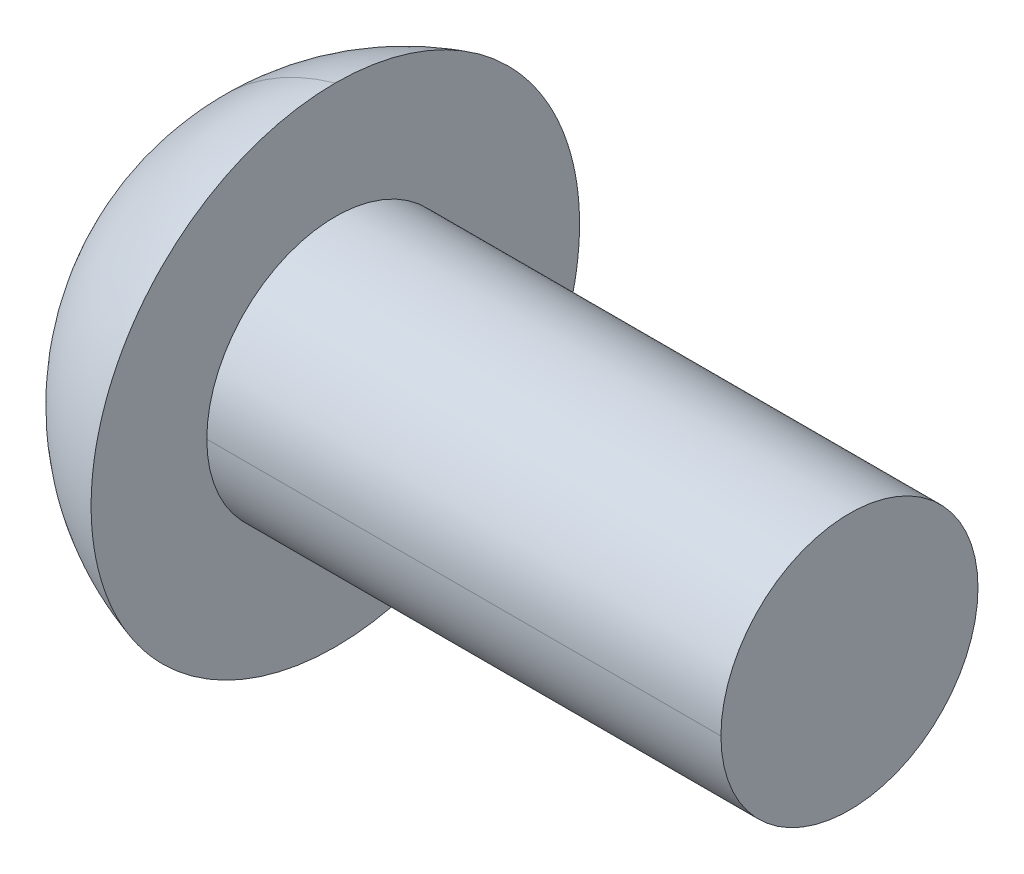
ISO-10303-21;
HEADER;
FILE_DESCRIPTION(('STEP AP214'),'2;1');
FILE_NAME('part.step','',(''),(''),'','','');
FILE_SCHEMA(('AUTOMOTIVE_DESIGN { 1 0 10303 214 1 1 1 1 }'));
ENDSEC;
DATA;
#1=APPLICATION_CONTEXT('core data for automotive mechanical design processes');
#2=APPLICATION_PROTOCOL_DEFINITION('international standard','automotive_design',2000,#1);
#3=PRODUCT_CONTEXT('',#1,'mechanical');
#4=PRODUCT('Part','Part','',(#3));
#5=PRODUCT_RELATED_PRODUCT_CATEGORY('part','',(#4));
#6=PRODUCT_DEFINITION_FORMATION('','',#4);
#7=PRODUCT_DEFINITION_CONTEXT('part definition',#1,'design');
#8=PRODUCT_DEFINITION('design','',#6,#7);
#9=PRODUCT_DEFINITION_SHAPE('','',#8);
#10=(LENGTH_UNIT() NAMED_UNIT(*) SI_UNIT(.MILLI.,.METRE.));
#11=(NAMED_UNIT(*) PLANE_ANGLE_UNIT() SI_UNIT($,.RADIAN.));
#12=(NAMED_UNIT(*) SI_UNIT($,.STERADIAN.) SOLID_ANGLE_UNIT());
#13=UNCERTAINTY_MEASURE_WITH_UNIT(LENGTH_MEASURE(1.E-05),#10,'distance_accuracy_value','');
#14=(GEOMETRIC_REPRESENTATION_CONTEXT(3) GLOBAL_UNCERTAINTY_ASSIGNED_CONTEXT((#13)) GLOBAL_UNIT_ASSIGNED_CONTEXT((#10,
#11,#12)) REPRESENTATION_CONTEXT('',''));
#15=CARTESIAN_POINT('',(0.,0.,0.));
#16=DIRECTION('',(0.,0.,1.));
#17=DIRECTION('',(1.,0.,0.));
#18=AXIS2_PLACEMENT_3D('',#15,#16,#17);
#19=CARTESIAN_POINT('',(1.04,1.,0.577350269189625));
#20=DIRECTION('',(0.86602540378444,0.25,0.433012701892218));
#21=DIRECTION('',(0.,-0.866025403784439,0.5));
#22=AXIS2_PLACEMENT_3D('',#19,#20,#21);
#23=PLANE('',#22);
#24=DIRECTION('',(0.,-0.866025403784439,0.5));
#25=VECTOR('',#24,1.);
#26=CARTESIAN_POINT('',(1.04,1.,0.577350269189625));
#27=LINE('',#26,#25);
#28=CARTESIAN_POINT('',(1.04,1.,0.577350269189625));
#29=VERTEX_POINT('',#28);
#30=CARTESIAN_POINT('',(1.04,0.,1.15470053837925));
#31=VERTEX_POINT('',#30);
#32=EDGE_CURVE('E208',#29,#31,#27,.T.);
#33=ORIENTED_EDGE('',*,*,#32,.F.);
#34=DIRECTION('',(-0.447213595499956,0.774596669241484,0.447213595499959));
#35=VECTOR('',#34,1.);
#36=CARTESIAN_POINT('',(1.04,1.,0.577350269189625));
#37=LINE('',#36,#35);
#38=CARTESIAN_POINT('',(1.61735026918963,0.,0.));
#39=VERTEX_POINT('',#38);
#40=EDGE_CURVE('E11',#39,#29,#37,.T.);
#41=ORIENTED_EDGE('',*,*,#40,.F.);
#42=DIRECTION('',(-0.447213595499956,0.,0.894427190999917));
#43=VECTOR('',#42,1.);
#44=CARTESIAN_POINT('',(1.04,0.,1.15470053837925));
#45=LINE('',#44,#43);
#46=EDGE_CURVE('E230',#39,#31,#45,.T.);
#47=ORIENTED_EDGE('',*,*,#46,.T.);
#48=EDGE_LOOP('',(#33,#41,#47));
#49=FACE_BOUND('',#48,.T.);
#50=ADVANCED_FACE('F17',(#49),#23,.F.);
#51=CARTESIAN_POINT('',(1.04,1.,-0.577350269189626));
#52=DIRECTION('',(0.86602540378444,0.5,0.));
#53=DIRECTION('',(0.,0.,-1.));
#54=AXIS2_PLACEMENT_3D('',#51,#52,#53);
#55=PLANE('',#54);
#56=DIRECTION('',(0.,0.,1.));
#57=VECTOR('',#56,1.);
#58=CARTESIAN_POINT('',(1.04,1.,-0.577350269189626));
#59=LINE('',#58,#57);
#60=CARTESIAN_POINT('',(1.04,1.,-0.577350269189626));
#61=VERTEX_POINT('',#60);
#62=EDGE_CURVE('E201',#61,#29,#59,.T.);
#63=ORIENTED_EDGE('',*,*,#62,.F.);
#64=DIRECTION('',(-0.447213595499956,0.774596669241484,-0.447213595499959));
#65=VECTOR('',#64,1.);
#66=CARTESIAN_POINT('',(1.04,1.,-0.577350269189626));
#67=LINE('',#66,#65);
#68=EDGE_CURVE('E25',#39,#61,#67,.T.);
#69=ORIENTED_EDGE('',*,*,#68,.F.);
#70=ORIENTED_EDGE('',*,*,#40,.T.);
#71=EDGE_LOOP('',(#63,#69,#70));
#72=FACE_BOUND('',#71,.T.);
#73=ADVANCED_FACE('F248',(#72),#55,.F.);
#74=CARTESIAN_POINT('',(1.04,0.,-1.15470053837925));
#75=DIRECTION('',(0.86602540378444,0.25,-0.433012701892218));
#76=DIRECTION('',(0.,-0.866025403784439,-0.5));
#77=AXIS2_PLACEMENT_3D('',#74,#75,#76);
#78=PLANE('',#77);
#79=DIRECTION('',(0.,0.866025403784439,0.5));
#80=VECTOR('',#79,1.);
#81=CARTESIAN_POINT('',(1.04,0.,-1.15470053837925));
#82=LINE('',#81,#80);
#83=CARTESIAN_POINT('',(1.04,0.,-1.15470053837925));
#84=VERTEX_POINT('',#83);
#85=EDGE_CURVE('E173',#84,#61,#82,.T.);
#86=ORIENTED_EDGE('',*,*,#85,.F.);
#87=DIRECTION('',(-0.447213595499956,0.,-0.894427190999917));
#88=VECTOR('',#87,1.);
#89=CARTESIAN_POINT('',(1.04,0.,-1.15470053837925));
#90=LINE('',#89,#88);
#91=EDGE_CURVE('E209',#39,#84,#90,.T.);
#92=ORIENTED_EDGE('',*,*,#91,.F.);
#93=ORIENTED_EDGE('',*,*,#68,.T.);
#94=EDGE_LOOP('',(#86,#92,#93));
#95=FACE_BOUND('',#94,.T.);
#96=ADVANCED_FACE('F243',(#95),#78,.F.);
#97=CARTESIAN_POINT('',(1.04,-1.,-0.577350269189628));
#98=DIRECTION('',(0.86602540378444,-0.25,-0.433012701892218));
#99=DIRECTION('',(0.,-0.866025403784439,0.5));
#100=AXIS2_PLACEMENT_3D('',#97,#98,#99);
#101=PLANE('',#100);
#102=DIRECTION('',(0.,0.866025403784439,-0.5));
#103=VECTOR('',#102,1.);
#104=CARTESIAN_POINT('',(1.04,-1.,-0.577350269189628));
#105=LINE('',#104,#103);
#106=CARTESIAN_POINT('',(1.04,-1.,-0.577350269189628));
#107=VERTEX_POINT('',#106);
#108=EDGE_CURVE('E174',#107,#84,#105,.T.);
#109=ORIENTED_EDGE('',*,*,#108,.F.);
#110=DIRECTION('',(-0.447213595499956,-0.774596669241484,-0.447213595499959));
#111=VECTOR('',#110,1.);
#112=CARTESIAN_POINT('',(1.04,-1.,-0.577350269189628));
#113=LINE('',#112,#111);
#114=EDGE_CURVE('E212',#39,#107,#113,.T.);
#115=ORIENTED_EDGE('',*,*,#114,.F.);
#116=ORIENTED_EDGE('',*,*,#91,.T.);
#117=EDGE_LOOP('',(#109,#115,#116));
#118=FACE_BOUND('',#117,.T.);
#119=ADVANCED_FACE('F261',(#118),#101,.F.);
#120=CARTESIAN_POINT('',(1.04,-1.,0.577350269189625));
#121=DIRECTION('',(0.86602540378444,-0.5,0.));
#122=DIRECTION('',(0.,0.,-1.));
#123=AXIS2_PLACEMENT_3D('',#120,#121,#122);
#124=PLANE('',#123);
#125=DIRECTION('',(0.,0.,-1.));
#126=VECTOR('',#125,1.);
#127=CARTESIAN_POINT('',(1.04,-1.,0.577350269189625));
#128=LINE('',#127,#126);
#129=CARTESIAN_POINT('',(1.04,-1.,0.577350269189625));
#130=VERTEX_POINT('',#129);
#131=EDGE_CURVE('E226',#130,#107,#128,.T.);
#132=ORIENTED_EDGE('',*,*,#131,.F.);
#133=DIRECTION('',(-0.447213595499956,-0.774596669241484,0.447213595499959));
#134=VECTOR('',#133,1.);
#135=CARTESIAN_POINT('',(1.04,-1.,0.577350269189625));
#136=LINE('',#135,#134);
#137=EDGE_CURVE('E47',#39,#130,#136,.T.);
#138=ORIENTED_EDGE('',*,*,#137,.F.);
#139=ORIENTED_EDGE('',*,*,#114,.T.);
#140=EDGE_LOOP('',(#132,#138,#139));
#141=FACE_BOUND('',#140,.T.);
#142=ADVANCED_FACE('F263',(#141),#124,.F.);
#143=CARTESIAN_POINT('',(1.04,0.,1.15470053837925));
#144=DIRECTION('',(0.86602540378444,-0.25,0.433012701892218));
#145=DIRECTION('',(0.,-0.866025403784439,-0.5));
#146=AXIS2_PLACEMENT_3D('',#143,#144,#145);
#147=PLANE('',#146);
#148=DIRECTION('',(0.,-0.866025403784439,-0.5));
#149=VECTOR('',#148,1.);
#150=CARTESIAN_POINT('',(1.04,0.,1.15470053837925));
#151=LINE('',#150,#149);
#152=EDGE_CURVE('E219',#31,#130,#151,.T.);
#153=ORIENTED_EDGE('',*,*,#152,.F.);
#154=ORIENTED_EDGE('',*,*,#46,.F.);
#155=ORIENTED_EDGE('',*,*,#137,.T.);
#156=EDGE_LOOP('',(#153,#154,#155));
#157=FACE_BOUND('',#156,.T.);
#158=ADVANCED_FACE('F265',(#157),#147,.F.);
#159=CARTESIAN_POINT('',(1.04,-1.,0.577350269189625));
#160=DIRECTION('',(0.,1.,0.));
#161=DIRECTION('',(1.,0.,0.));
#162=AXIS2_PLACEMENT_3D('',#159,#160,#161);
#163=PLANE('',#162);
#164=DIRECTION('',(0.,0.,-1.));
#165=VECTOR('',#164,1.);
#166=CARTESIAN_POINT('',(0.,-1.,0.577350269189625));
#167=LINE('',#166,#165);
#168=CARTESIAN_POINT('',(0.,-1.,0.577350269189625));
#169=VERTEX_POINT('',#168);
#170=CARTESIAN_POINT('',(0.,-1.,-0.577350269189628));
#171=VERTEX_POINT('',#170);
#172=EDGE_CURVE('E185',#169,#171,#167,.T.);
#173=ORIENTED_EDGE('',*,*,#172,.F.);
#174=DIRECTION('',(-1.,0.,0.));
#175=VECTOR('',#174,1.);
#176=CARTESIAN_POINT('',(1.04,-1.,0.577350269189625));
#177=LINE('',#176,#175);
#178=EDGE_CURVE('E223',#130,#169,#177,.T.);
#179=ORIENTED_EDGE('',*,*,#178,.F.);
#180=ORIENTED_EDGE('',*,*,#131,.T.);
#181=DIRECTION('',(-1.,0.,0.));
#182=VECTOR('',#181,1.);
#183=CARTESIAN_POINT('',(1.04,-1.,-0.577350269189628));
#184=LINE('',#183,#182);
#185=EDGE_CURVE('E189',#107,#171,#184,.T.);
#186=ORIENTED_EDGE('',*,*,#185,.T.);
#187=EDGE_LOOP('',(#173,#179,#180,#186));
#188=FACE_BOUND('',#187,.T.);
#189=ADVANCED_FACE('F331',(#188),#163,.T.);
#190=CARTESIAN_POINT('',(1.04,0.,1.15470053837925));
#191=DIRECTION('',(0.,0.5,-0.866025403784439));
#192=DIRECTION('',(-1.,0.,0.));
#193=AXIS2_PLACEMENT_3D('',#190,#191,#192);
#194=PLANE('',#193);
#195=DIRECTION('',(0.,-0.866025403784439,-0.5));
#196=VECTOR('',#195,1.);
#197=CARTESIAN_POINT('',(0.,0.,1.15470053837925));
#198=LINE('',#197,#196);
#199=CARTESIAN_POINT('',(0.,0.,1.15470053837925));
#200=VERTEX_POINT('',#199);
#201=EDGE_CURVE('E182',#200,#169,#198,.T.);
#202=ORIENTED_EDGE('',*,*,#201,.F.);
#203=DIRECTION('',(-1.,0.,0.));
#204=VECTOR('',#203,1.);
#205=CARTESIAN_POINT('',(1.04,0.,1.15470053837925));
#206=LINE('',#205,#204);
#207=EDGE_CURVE('E216',#31,#200,#206,.T.);
#208=ORIENTED_EDGE('',*,*,#207,.F.);
#209=ORIENTED_EDGE('',*,*,#152,.T.);
#210=ORIENTED_EDGE('',*,*,#178,.T.);
#211=EDGE_LOOP('',(#202,#208,#209,#210));
#212=FACE_BOUND('',#211,.T.);
#213=ADVANCED_FACE('F329',(#212),#194,.T.);
#214=CARTESIAN_POINT('',(1.04,1.,0.577350269189625));
#215=DIRECTION('',(0.,-0.5,-0.866025403784439));
#216=DIRECTION('',(0.,-0.866025403784439,0.5));
#217=AXIS2_PLACEMENT_3D('',#214,#215,#216);
#218=PLANE('',#217);
#219=DIRECTION('',(0.,-0.866025403784439,0.5));
#220=VECTOR('',#219,1.);
#221=CARTESIAN_POINT('',(0.,1.,0.577350269189625));
#222=LINE('',#221,#220);
#223=CARTESIAN_POINT('',(0.,1.,0.577350269189625));
#224=VERTEX_POINT('',#223);
#225=EDGE_CURVE('E178',#224,#200,#222,.T.);
#226=ORIENTED_EDGE('',*,*,#225,.F.);
#227=DIRECTION('',(-1.,0.,0.));
#228=VECTOR('',#227,1.);
#229=CARTESIAN_POINT('',(1.04,1.,0.577350269189625));
#230=LINE('',#229,#228);
#231=EDGE_CURVE('E205',#29,#224,#230,.T.);
#232=ORIENTED_EDGE('',*,*,#231,.F.);
#233=ORIENTED_EDGE('',*,*,#32,.T.);
#234=ORIENTED_EDGE('',*,*,#207,.T.);
#235=EDGE_LOOP('',(#226,#232,#233,#234));
#236=FACE_BOUND('',#235,.T.);
#237=ADVANCED_FACE('F270',(#236),#218,.T.);
#238=CARTESIAN_POINT('',(1.04,1.,-0.577350269189626));
#239=DIRECTION('',(0.,-1.,0.));
#240=DIRECTION('',(-1.,0.,0.));
#241=AXIS2_PLACEMENT_3D('',#238,#239,#240);
#242=PLANE('',#241);
#243=DIRECTION('',(0.,0.,1.));
#244=VECTOR('',#243,1.);
#245=CARTESIAN_POINT('',(0.,1.,-0.577350269189626));
#246=LINE('',#245,#244);
#247=CARTESIAN_POINT('',(0.,1.,-0.577350269189626));
#248=VERTEX_POINT('',#247);
#249=EDGE_CURVE('E165',#248,#224,#246,.T.);
#250=ORIENTED_EDGE('',*,*,#249,.F.);
#251=DIRECTION('',(-1.,0.,0.));
#252=VECTOR('',#251,1.);
#253=CARTESIAN_POINT('',(1.04,1.,-0.577350269189626));
#254=LINE('',#253,#252);
#255=EDGE_CURVE('E198',#61,#248,#254,.T.);
#256=ORIENTED_EDGE('',*,*,#255,.F.);
#257=ORIENTED_EDGE('',*,*,#62,.T.);
#258=ORIENTED_EDGE('',*,*,#231,.T.);
#259=EDGE_LOOP('',(#250,#256,#257,#258));
#260=FACE_BOUND('',#259,.T.);
#261=ADVANCED_FACE('F251',(#260),#242,.T.);
#262=CARTESIAN_POINT('',(1.04,0.,-1.15470053837925));
#263=DIRECTION('',(0.,-0.5,0.866025403784439));
#264=DIRECTION('',(-1.,0.,0.));
#265=AXIS2_PLACEMENT_3D('',#262,#263,#264);
#266=PLANE('',#265);
#267=DIRECTION('',(0.,0.866025403784439,0.5));
#268=VECTOR('',#267,1.);
#269=CARTESIAN_POINT('',(0.,0.,-1.15470053837925));
#270=LINE('',#269,#268);
#271=CARTESIAN_POINT('',(0.,0.,-1.15470053837925));
#272=VERTEX_POINT('',#271);
#273=EDGE_CURVE('E161',#272,#248,#270,.T.);
#274=ORIENTED_EDGE('',*,*,#273,.F.);
#275=DIRECTION('',(-1.,0.,0.));
#276=VECTOR('',#275,1.);
#277=CARTESIAN_POINT('',(1.04,0.,-1.15470053837925));
#278=LINE('',#277,#276);
#279=EDGE_CURVE('E170',#84,#272,#278,.T.);
#280=ORIENTED_EDGE('',*,*,#279,.F.);
#281=ORIENTED_EDGE('',*,*,#85,.T.);
#282=ORIENTED_EDGE('',*,*,#255,.T.);
#283=EDGE_LOOP('',(#274,#280,#281,#282));
#284=FACE_BOUND('',#283,.T.);
#285=ADVANCED_FACE('F254',(#284),#266,.T.);
#286=CARTESIAN_POINT('',(1.04,-1.,-0.577350269189628));
#287=DIRECTION('',(0.,0.5,0.866025403784439));
#288=DIRECTION('',(1.,0.,0.));
#289=AXIS2_PLACEMENT_3D('',#286,#287,#288);
#290=PLANE('',#289);
#291=DIRECTION('',(0.,0.866025403784439,-0.5));
#292=VECTOR('',#291,1.);
#293=CARTESIAN_POINT('',(0.,-1.,-0.577350269189628));
#294=LINE('',#293,#292);
#295=EDGE_CURVE('E166',#171,#272,#294,.T.);
#296=ORIENTED_EDGE('',*,*,#295,.F.);
#297=ORIENTED_EDGE('',*,*,#185,.F.);
#298=ORIENTED_EDGE('',*,*,#108,.T.);
#299=ORIENTED_EDGE('',*,*,#279,.T.);
#300=EDGE_LOOP('',(#296,#297,#298,#299));
#301=FACE_BOUND('',#300,.T.);
#302=ADVANCED_FACE('F259',(#301),#290,.T.);
#303=CARTESIAN_POINT('',(2.46136363636363,0.,0.));
#304=DIRECTION('',(0.,0.,-1.));
#305=DIRECTION('',(0.,1.,0.));
#306=AXIS2_PLACEMENT_3D('',#303,#304,#305);
#307=SPHERICAL_SURFACE('',#306,2.96324331610032);
#308=CARTESIAN_POINT('',(2.46136363636363,0.,0.));
#309=DIRECTION('',(0.,0.,-1.));
#310=DIRECTION('',(0.,1.,0.));
#311=AXIS2_PLACEMENT_3D('',#308,#309,#310);
#312=CIRCLE('',#311,2.96324331610032);
#313=CARTESIAN_POINT('',(1.65,-2.85,0.));
#314=VERTEX_POINT('',#313);
#315=CARTESIAN_POINT('',(0.,-1.65,0.));
#316=VERTEX_POINT('',#315);
#317=EDGE_CURVE('E286',#314,#316,#312,.T.);
#318=ORIENTED_EDGE('',*,*,#317,.F.);
#319=CARTESIAN_POINT('',(1.65,0.,0.));
#320=DIRECTION('',(-1.,0.,0.));
#321=DIRECTION('',(0.,0.,1.));
#322=AXIS2_PLACEMENT_3D('',#319,#320,#321);
#323=CIRCLE('',#322,2.85);
#324=CARTESIAN_POINT('',(1.65,2.85,0.));
#325=VERTEX_POINT('',#324);
#326=EDGE_CURVE('E137',#314,#325,#323,.T.);
#327=ORIENTED_EDGE('',*,*,#326,.T.);
#328=CARTESIAN_POINT('',(2.46136363636363,0.,0.));
#329=DIRECTION('',(0.,0.,1.));
#330=DIRECTION('',(1.,0.,0.));
#331=AXIS2_PLACEMENT_3D('',#328,#329,#330);
#332=CIRCLE('',#331,2.96324331610032);
#333=CARTESIAN_POINT('',(0.,1.65,0.));
#334=VERTEX_POINT('',#333);
#335=EDGE_CURVE('E293',#325,#334,#332,.T.);
#336=ORIENTED_EDGE('',*,*,#335,.T.);
#337=CARTESIAN_POINT('',(0.,0.,0.));
#338=DIRECTION('',(-1.,0.,0.));
#339=DIRECTION('',(0.,0.,1.));
#340=AXIS2_PLACEMENT_3D('',#337,#338,#339);
#341=CIRCLE('',#340,1.65);
#342=EDGE_CURVE('E146',#316,#334,#341,.T.);
#343=ORIENTED_EDGE('',*,*,#342,.F.);
#344=EDGE_LOOP('',(#318,#327,#336,#343));
#345=FACE_BOUND('',#344,.T.);
#346=ADVANCED_FACE('F307',(#345),#307,.T.);
#347=CARTESIAN_POINT('',(7.65,0.,0.));
#348=DIRECTION('',(1.,0.,0.));
#349=DIRECTION('',(0.,1.,0.));
#350=AXIS2_PLACEMENT_3D('',#347,#348,#349);
#351=PLANE('',#350);
#352=CARTESIAN_POINT('',(7.65,0.,0.));
#353=DIRECTION('',(1.,0.,0.));
#354=DIRECTION('',(0.,0.,-1.));
#355=AXIS2_PLACEMENT_3D('',#352,#353,#354);
#356=CIRCLE('',#355,1.5);
#357=CARTESIAN_POINT('',(7.65,0.,1.5));
#358=VERTEX_POINT('',#357);
#359=CARTESIAN_POINT('',(7.65,0.,-1.5));
#360=VERTEX_POINT('',#359);
#361=EDGE_CURVE('E136',#358,#360,#356,.T.);
#362=ORIENTED_EDGE('',*,*,#361,.T.);
#363=CARTESIAN_POINT('',(7.65,0.,0.));
#364=DIRECTION('',(1.,0.,0.));
#365=DIRECTION('',(0.,0.,-1.));
#366=AXIS2_PLACEMENT_3D('',#363,#364,#365);
#367=CIRCLE('',#366,1.5);
#368=EDGE_CURVE('E156',#360,#358,#367,.T.);
#369=ORIENTED_EDGE('',*,*,#368,.T.);
#370=EDGE_LOOP('',(#362,#369));
#371=FACE_BOUND('',#370,.T.);
#372=ADVANCED_FACE('F305',(#371),#351,.T.);
#373=CARTESIAN_POINT('',(7.65,0.,0.));
#374=DIRECTION('',(-1.,0.,0.));
#375=DIRECTION('',(0.,0.,1.));
#376=AXIS2_PLACEMENT_3D('',#373,#374,#375);
#377=CYLINDRICAL_SURFACE('',#376,1.5);
#378=DIRECTION('',(-1.,0.,0.));
#379=VECTOR('',#378,1.);
#380=CARTESIAN_POINT('',(7.65,0.,-1.5));
#381=LINE('',#380,#379);
#382=CARTESIAN_POINT('',(1.65,0.,-1.5));
#383=VERTEX_POINT('',#382);
#384=EDGE_CURVE('E149',#360,#383,#381,.T.);
#385=ORIENTED_EDGE('',*,*,#384,.F.);
#386=ORIENTED_EDGE('',*,*,#361,.F.);
#387=DIRECTION('',(-1.,0.,0.));
#388=VECTOR('',#387,1.);
#389=CARTESIAN_POINT('',(7.65,0.,1.5));
#390=LINE('',#389,#388);
#391=CARTESIAN_POINT('',(1.65,0.,1.5));
#392=VERTEX_POINT('',#391);
#393=EDGE_CURVE('E140',#358,#392,#390,.T.);
#394=ORIENTED_EDGE('',*,*,#393,.T.);
#395=CARTESIAN_POINT('',(1.65,0.,0.));
#396=DIRECTION('',(1.,0.,0.));
#397=DIRECTION('',(0.,0.,-1.));
#398=AXIS2_PLACEMENT_3D('',#395,#396,#397);
#399=CIRCLE('',#398,1.5);
#400=EDGE_CURVE('E126',#392,#383,#399,.T.);
#401=ORIENTED_EDGE('',*,*,#400,.T.);
#402=EDGE_LOOP('',(#385,#386,#394,#401));
#403=FACE_BOUND('',#402,.T.);
#404=ADVANCED_FACE('F141',(#403),#377,.T.);
#405=CARTESIAN_POINT('',(1.65,0.,0.));
#406=DIRECTION('',(1.,0.,0.));
#407=DIRECTION('',(0.,1.,0.));
#408=AXIS2_PLACEMENT_3D('',#405,#406,#407);
#409=PLANE('',#408);
#410=ORIENTED_EDGE('',*,*,#400,.F.);
#411=CARTESIAN_POINT('',(1.65,0.,0.));
#412=DIRECTION('',(1.,0.,0.));
#413=DIRECTION('',(0.,0.,-1.));
#414=AXIS2_PLACEMENT_3D('',#411,#412,#413);
#415=CIRCLE('',#414,1.5);
#416=EDGE_CURVE('E131',#383,#392,#415,.T.);
#417=ORIENTED_EDGE('',*,*,#416,.F.);
#418=EDGE_LOOP('',(#410,#417));
#419=FACE_BOUND('',#418,.T.);
#420=CARTESIAN_POINT('',(1.65,0.,0.));
#421=DIRECTION('',(-1.,0.,0.));
#422=DIRECTION('',(0.,0.,1.));
#423=AXIS2_PLACEMENT_3D('',#420,#421,#422);
#424=CIRCLE('',#423,2.85);
#425=EDGE_CURVE('E694',#325,#314,#424,.T.);
#426=ORIENTED_EDGE('',*,*,#425,.F.);
#427=ORIENTED_EDGE('',*,*,#326,.F.);
#428=EDGE_LOOP('',(#426,#427));
#429=FACE_BOUND('',#428,.T.);
#430=ADVANCED_FACE('F128',(#419,#429),#409,.T.);
#431=CARTESIAN_POINT('',(0.,0.,0.));
#432=DIRECTION('',(1.,0.,0.));
#433=DIRECTION('',(0.,1.,0.));
#434=AXIS2_PLACEMENT_3D('',#431,#432,#433);
#435=PLANE('',#434);
#436=ORIENTED_EDGE('',*,*,#295,.T.);
#437=ORIENTED_EDGE('',*,*,#273,.T.);
#438=ORIENTED_EDGE('',*,*,#249,.T.);
#439=ORIENTED_EDGE('',*,*,#225,.T.);
#440=ORIENTED_EDGE('',*,*,#201,.T.);
#441=ORIENTED_EDGE('',*,*,#172,.T.);
#442=EDGE_LOOP('',(#436,#437,#438,#439,#440,#441));
#443=FACE_BOUND('',#442,.T.);
#444=CARTESIAN_POINT('',(0.,0.,0.));
#445=DIRECTION('',(-1.,0.,0.));
#446=DIRECTION('',(0.,0.,1.));
#447=AXIS2_PLACEMENT_3D('',#444,#445,#446);
#448=CIRCLE('',#447,1.65);
#449=EDGE_CURVE('E289',#334,#316,#448,.T.);
#450=ORIENTED_EDGE('',*,*,#449,.T.);
#451=ORIENTED_EDGE('',*,*,#342,.T.);
#452=EDGE_LOOP('',(#450,#451));
#453=FACE_BOUND('',#452,.T.);
#454=ADVANCED_FACE('F273',(#443,#453),#435,.F.);
#455=CARTESIAN_POINT('',(7.65,0.,0.));
#456=DIRECTION('',(-1.,0.,0.));
#457=DIRECTION('',(0.,0.,1.));
#458=AXIS2_PLACEMENT_3D('',#455,#456,#457);
#459=CYLINDRICAL_SURFACE('',#458,1.5);
#460=ORIENTED_EDGE('',*,*,#368,.F.);
#461=ORIENTED_EDGE('',*,*,#384,.T.);
#462=ORIENTED_EDGE('',*,*,#416,.T.);
#463=ORIENTED_EDGE('',*,*,#393,.F.);
#464=EDGE_LOOP('',(#460,#461,#462,#463));
#465=FACE_BOUND('',#464,.T.);
#466=ADVANCED_FACE('F148',(#465),#459,.T.);
#467=CARTESIAN_POINT('',(2.46136363636363,0.,0.));
#468=DIRECTION('',(0.,0.,-1.));
#469=DIRECTION('',(0.,1.,0.));
#470=AXIS2_PLACEMENT_3D('',#467,#468,#469);
#471=SPHERICAL_SURFACE('',#470,2.96324331610032);
#472=ORIENTED_EDGE('',*,*,#425,.T.);
#473=ORIENTED_EDGE('',*,*,#317,.T.);
#474=ORIENTED_EDGE('',*,*,#449,.F.);
#475=ORIENTED_EDGE('',*,*,#335,.F.);
#476=EDGE_LOOP('',(#472,#473,#474,#475));
#477=FACE_BOUND('',#476,.T.);
#478=ADVANCED_FACE('F584',(#477),#471,.T.);
#479=CLOSED_SHELL('',(#50,#73,#96,#119,#142,#158,#189,#213,#237,#261,#285,#302,#346,#372,#404,
#430,#454,#466,#478));
#480=MANIFOLD_SOLID_BREP('B1',#479);
#481=ADVANCED_BREP_SHAPE_REPRESENTATION('',(#18,#480),#14);
#482=SHAPE_DEFINITION_REPRESENTATION(#9,#481);
ENDSEC;
END-ISO-10303-21;
